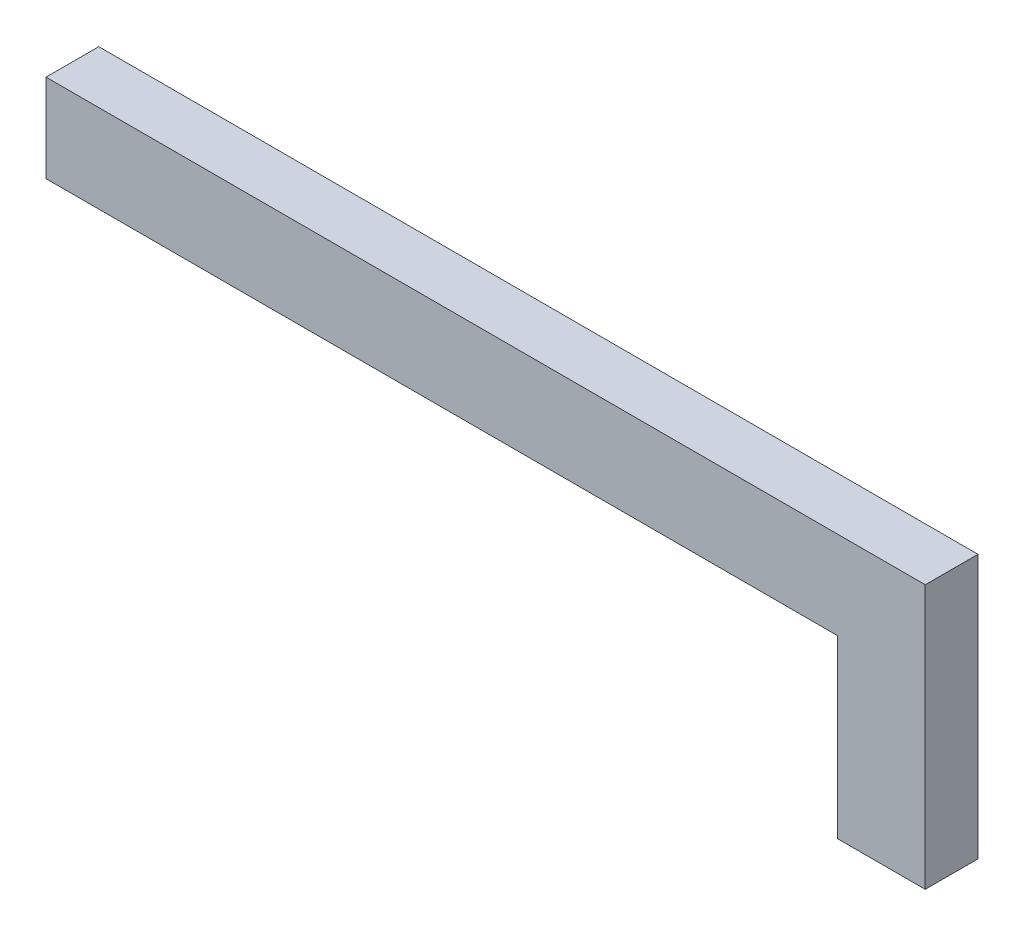
ISO-10303-21;
HEADER;
FILE_DESCRIPTION(('STEP AP214'),'2;1');
FILE_NAME('part.step','',(''),(''),'','','');
FILE_SCHEMA(('AUTOMOTIVE_DESIGN { 1 0 10303 214 1 1 1 1 }'));
ENDSEC;
DATA;
#1=APPLICATION_CONTEXT('core data for automotive mechanical design processes');
#2=APPLICATION_PROTOCOL_DEFINITION('international standard','automotive_design',2000,#1);
#3=PRODUCT_CONTEXT('',#1,'mechanical');
#4=PRODUCT('Part','Part','',(#3));
#5=PRODUCT_RELATED_PRODUCT_CATEGORY('part','',(#4));
#6=PRODUCT_DEFINITION_FORMATION('','',#4);
#7=PRODUCT_DEFINITION_CONTEXT('part definition',#1,'design');
#8=PRODUCT_DEFINITION('design','',#6,#7);
#9=PRODUCT_DEFINITION_SHAPE('','',#8);
#10=(LENGTH_UNIT() NAMED_UNIT(*) SI_UNIT(.MILLI.,.METRE.));
#11=(NAMED_UNIT(*) PLANE_ANGLE_UNIT() SI_UNIT($,.RADIAN.));
#12=(NAMED_UNIT(*) SI_UNIT($,.STERADIAN.) SOLID_ANGLE_UNIT());
#13=UNCERTAINTY_MEASURE_WITH_UNIT(LENGTH_MEASURE(1.E-05),#10,'distance_accuracy_value','');
#14=(GEOMETRIC_REPRESENTATION_CONTEXT(3) GLOBAL_UNCERTAINTY_ASSIGNED_CONTEXT((#13)) GLOBAL_UNIT_ASSIGNED_CONTEXT((#10,
#11,#12)) REPRESENTATION_CONTEXT('',''));
#15=CARTESIAN_POINT('',(0.,0.,0.));
#16=DIRECTION('',(0.,0.,1.));
#17=DIRECTION('',(1.,0.,0.));
#18=AXIS2_PLACEMENT_3D('',#15,#16,#17);
#19=CARTESIAN_POINT('',(-25.,-2.5,3.));
#20=DIRECTION('',(1.,0.,0.));
#21=DIRECTION('',(0.,0.,-1.));
#22=AXIS2_PLACEMENT_3D('',#19,#20,#21);
#23=PLANE('',#22);
#24=DIRECTION('',(0.,-1.,0.));
#25=VECTOR('',#24,1.);
#26=CARTESIAN_POINT('',(-25.,-2.5,0.));
#27=LINE('',#26,#25);
#28=CARTESIAN_POINT('',(-25.,2.5,0.));
#29=VERTEX_POINT('',#28);
#30=CARTESIAN_POINT('',(-25.,-2.5,0.));
#31=VERTEX_POINT('',#30);
#32=EDGE_CURVE('E128',#29,#31,#27,.T.);
#33=ORIENTED_EDGE('',*,*,#32,.T.);
#34=DIRECTION('',(0.,0.,-1.));
#35=VECTOR('',#34,1.);
#36=CARTESIAN_POINT('',(-25.,-2.5,3.));
#37=LINE('',#36,#35);
#38=CARTESIAN_POINT('',(-25.,-2.5,3.));
#39=VERTEX_POINT('',#38);
#40=EDGE_CURVE('E11',#39,#31,#37,.T.);
#41=ORIENTED_EDGE('',*,*,#40,.F.);
#42=DIRECTION('',(0.,-1.,0.));
#43=VECTOR('',#42,1.);
#44=CARTESIAN_POINT('',(-25.,-2.5,3.));
#45=LINE('',#44,#43);
#46=CARTESIAN_POINT('',(-25.,2.5,3.));
#47=VERTEX_POINT('',#46);
#48=EDGE_CURVE('E144',#47,#39,#45,.T.);
#49=ORIENTED_EDGE('',*,*,#48,.F.);
#50=DIRECTION('',(0.,0.,-1.));
#51=VECTOR('',#50,1.);
#52=CARTESIAN_POINT('',(-25.,2.5,3.));
#53=LINE('',#52,#51);
#54=EDGE_CURVE('E124',#47,#29,#53,.T.);
#55=ORIENTED_EDGE('',*,*,#54,.T.);
#56=EDGE_LOOP('',(#33,#41,#49,#55));
#57=FACE_BOUND('',#56,.T.);
#58=ADVANCED_FACE('F39',(#57),#23,.F.);
#59=CARTESIAN_POINT('',(20.,-2.5,3.));
#60=DIRECTION('',(0.,1.,0.));
#61=DIRECTION('',(-1.,0.,0.));
#62=AXIS2_PLACEMENT_3D('',#59,#60,#61);
#63=PLANE('',#62);
#64=DIRECTION('',(1.,0.,0.));
#65=VECTOR('',#64,1.);
#66=CARTESIAN_POINT('',(20.,-2.5,0.));
#67=LINE('',#66,#65);
#68=CARTESIAN_POINT('',(20.,-2.5,0.));
#69=VERTEX_POINT('',#68);
#70=EDGE_CURVE('E132',#31,#69,#67,.T.);
#71=ORIENTED_EDGE('',*,*,#70,.T.);
#72=DIRECTION('',(0.,0.,-1.));
#73=VECTOR('',#72,1.);
#74=CARTESIAN_POINT('',(20.,-2.5,3.));
#75=LINE('',#74,#73);
#76=CARTESIAN_POINT('',(20.,-2.5,3.));
#77=VERTEX_POINT('',#76);
#78=EDGE_CURVE('E48',#77,#69,#75,.T.);
#79=ORIENTED_EDGE('',*,*,#78,.F.);
#80=DIRECTION('',(1.,0.,0.));
#81=VECTOR('',#80,1.);
#82=CARTESIAN_POINT('',(20.,-2.5,3.));
#83=LINE('',#82,#81);
#84=EDGE_CURVE('E92',#39,#77,#83,.T.);
#85=ORIENTED_EDGE('',*,*,#84,.F.);
#86=ORIENTED_EDGE('',*,*,#40,.T.);
#87=EDGE_LOOP('',(#71,#79,#85,#86));
#88=FACE_BOUND('',#87,.T.);
#89=ADVANCED_FACE('F172',(#88),#63,.F.);
#90=CARTESIAN_POINT('',(20.,-2.5,3.));
#91=DIRECTION('',(1.,0.,0.));
#92=DIRECTION('',(0.,1.,0.));
#93=AXIS2_PLACEMENT_3D('',#90,#91,#92);
#94=PLANE('',#93);
#95=DIRECTION('',(0.,-1.,0.));
#96=VECTOR('',#95,1.);
#97=CARTESIAN_POINT('',(20.,-2.5,0.));
#98=LINE('',#97,#96);
#99=CARTESIAN_POINT('',(20.,-12.5,0.));
#100=VERTEX_POINT('',#99);
#101=EDGE_CURVE('E135',#69,#100,#98,.T.);
#102=ORIENTED_EDGE('',*,*,#101,.T.);
#103=DIRECTION('',(0.,0.,-1.));
#104=VECTOR('',#103,1.);
#105=CARTESIAN_POINT('',(20.,-12.5,3.));
#106=LINE('',#105,#104);
#107=CARTESIAN_POINT('',(20.,-12.5,3.));
#108=VERTEX_POINT('',#107);
#109=EDGE_CURVE('E117',#108,#100,#106,.T.);
#110=ORIENTED_EDGE('',*,*,#109,.F.);
#111=DIRECTION('',(0.,-1.,0.));
#112=VECTOR('',#111,1.);
#113=CARTESIAN_POINT('',(20.,-2.5,3.));
#114=LINE('',#113,#112);
#115=EDGE_CURVE('E105',#77,#108,#114,.T.);
#116=ORIENTED_EDGE('',*,*,#115,.F.);
#117=ORIENTED_EDGE('',*,*,#78,.T.);
#118=EDGE_LOOP('',(#102,#110,#116,#117));
#119=FACE_BOUND('',#118,.T.);
#120=ADVANCED_FACE('F154',(#119),#94,.F.);
#121=CARTESIAN_POINT('',(20.,-12.5,3.));
#122=DIRECTION('',(0.,1.,0.));
#123=DIRECTION('',(0.,0.,1.));
#124=AXIS2_PLACEMENT_3D('',#121,#122,#123);
#125=PLANE('',#124);
#126=DIRECTION('',(1.,0.,0.));
#127=VECTOR('',#126,1.);
#128=CARTESIAN_POINT('',(20.,-12.5,0.));
#129=LINE('',#128,#127);
#130=CARTESIAN_POINT('',(25.,-12.5,0.));
#131=VERTEX_POINT('',#130);
#132=EDGE_CURVE('E115',#100,#131,#129,.T.);
#133=ORIENTED_EDGE('',*,*,#132,.T.);
#134=DIRECTION('',(0.,0.,-1.));
#135=VECTOR('',#134,1.);
#136=CARTESIAN_POINT('',(25.,-12.5,3.));
#137=LINE('',#136,#135);
#138=CARTESIAN_POINT('',(25.,-12.5,3.));
#139=VERTEX_POINT('',#138);
#140=EDGE_CURVE('E112',#139,#131,#137,.T.);
#141=ORIENTED_EDGE('',*,*,#140,.F.);
#142=DIRECTION('',(1.,0.,0.));
#143=VECTOR('',#142,1.);
#144=CARTESIAN_POINT('',(20.,-12.5,3.));
#145=LINE('',#144,#143);
#146=EDGE_CURVE('E99',#108,#139,#145,.T.);
#147=ORIENTED_EDGE('',*,*,#146,.F.);
#148=ORIENTED_EDGE('',*,*,#109,.T.);
#149=EDGE_LOOP('',(#133,#141,#147,#148));
#150=FACE_BOUND('',#149,.T.);
#151=ADVANCED_FACE('F113',(#150),#125,.F.);
#152=CARTESIAN_POINT('',(25.,-2.5,3.));
#153=DIRECTION('',(-1.,0.,0.));
#154=DIRECTION('',(0.,0.,1.));
#155=AXIS2_PLACEMENT_3D('',#152,#153,#154);
#156=PLANE('',#155);
#157=DIRECTION('',(0.,1.,0.));
#158=VECTOR('',#157,1.);
#159=CARTESIAN_POINT('',(25.,-2.5,0.));
#160=LINE('',#159,#158);
#161=CARTESIAN_POINT('',(25.,2.5,0.));
#162=VERTEX_POINT('',#161);
#163=EDGE_CURVE('E78',#131,#162,#160,.T.);
#164=ORIENTED_EDGE('',*,*,#163,.T.);
#165=DIRECTION('',(0.,0.,-1.));
#166=VECTOR('',#165,1.);
#167=CARTESIAN_POINT('',(25.,2.5,3.));
#168=LINE('',#167,#166);
#169=CARTESIAN_POINT('',(25.,2.5,3.));
#170=VERTEX_POINT('',#169);
#171=EDGE_CURVE('E118',#170,#162,#168,.T.);
#172=ORIENTED_EDGE('',*,*,#171,.F.);
#173=DIRECTION('',(0.,1.,0.));
#174=VECTOR('',#173,1.);
#175=CARTESIAN_POINT('',(25.,-2.5,3.));
#176=LINE('',#175,#174);
#177=EDGE_CURVE('E103',#139,#170,#176,.T.);
#178=ORIENTED_EDGE('',*,*,#177,.F.);
#179=ORIENTED_EDGE('',*,*,#140,.T.);
#180=EDGE_LOOP('',(#164,#172,#178,#179));
#181=FACE_BOUND('',#180,.T.);
#182=ADVANCED_FACE('F120',(#181),#156,.F.);
#183=CARTESIAN_POINT('',(25.,2.5,3.));
#184=DIRECTION('',(0.,-1.,0.));
#185=DIRECTION('',(1.,0.,0.));
#186=AXIS2_PLACEMENT_3D('',#183,#184,#185);
#187=PLANE('',#186);
#188=DIRECTION('',(-1.,0.,0.));
#189=VECTOR('',#188,1.);
#190=CARTESIAN_POINT('',(25.,2.5,0.));
#191=LINE('',#190,#189);
#192=EDGE_CURVE('E84',#162,#29,#191,.T.);
#193=ORIENTED_EDGE('',*,*,#192,.T.);
#194=ORIENTED_EDGE('',*,*,#54,.F.);
#195=DIRECTION('',(-1.,0.,0.));
#196=VECTOR('',#195,1.);
#197=CARTESIAN_POINT('',(25.,2.5,3.));
#198=LINE('',#197,#196);
#199=EDGE_CURVE('E56',#170,#47,#198,.T.);
#200=ORIENTED_EDGE('',*,*,#199,.F.);
#201=ORIENTED_EDGE('',*,*,#171,.T.);
#202=EDGE_LOOP('',(#193,#194,#200,#201));
#203=FACE_BOUND('',#202,.T.);
#204=ADVANCED_FACE('F161',(#203),#187,.F.);
#205=CARTESIAN_POINT('',(0.,0.,3.));
#206=DIRECTION('',(0.,0.,1.));
#207=DIRECTION('',(1.,0.,0.));
#208=AXIS2_PLACEMENT_3D('',#205,#206,#207);
#209=PLANE('',#208);
#210=ORIENTED_EDGE('',*,*,#48,.T.);
#211=ORIENTED_EDGE('',*,*,#84,.T.);
#212=ORIENTED_EDGE('',*,*,#115,.T.);
#213=ORIENTED_EDGE('',*,*,#146,.T.);
#214=ORIENTED_EDGE('',*,*,#177,.T.);
#215=ORIENTED_EDGE('',*,*,#199,.T.);
#216=EDGE_LOOP('',(#210,#211,#212,#213,#214,#215));
#217=FACE_BOUND('',#216,.T.);
#218=ADVANCED_FACE('F101',(#217),#209,.T.);
#219=CARTESIAN_POINT('',(0.,0.,0.));
#220=DIRECTION('',(0.,0.,1.));
#221=DIRECTION('',(1.,0.,0.));
#222=AXIS2_PLACEMENT_3D('',#219,#220,#221);
#223=PLANE('',#222);
#224=ORIENTED_EDGE('',*,*,#32,.F.);
#225=ORIENTED_EDGE('',*,*,#192,.F.);
#226=ORIENTED_EDGE('',*,*,#163,.F.);
#227=ORIENTED_EDGE('',*,*,#132,.F.);
#228=ORIENTED_EDGE('',*,*,#101,.F.);
#229=ORIENTED_EDGE('',*,*,#70,.F.);
#230=EDGE_LOOP('',(#224,#225,#226,#227,#228,#229));
#231=FACE_BOUND('',#230,.T.);
#232=ADVANCED_FACE('F157',(#231),#223,.F.);
#233=CLOSED_SHELL('',(#58,#89,#120,#151,#182,#204,#218,#232));
#234=MANIFOLD_SOLID_BREP('B2',#233);
#235=ADVANCED_BREP_SHAPE_REPRESENTATION('',(#18,#234),#14);
#236=SHAPE_DEFINITION_REPRESENTATION(#9,#235);
ENDSEC;
END-ISO-10303-21;
